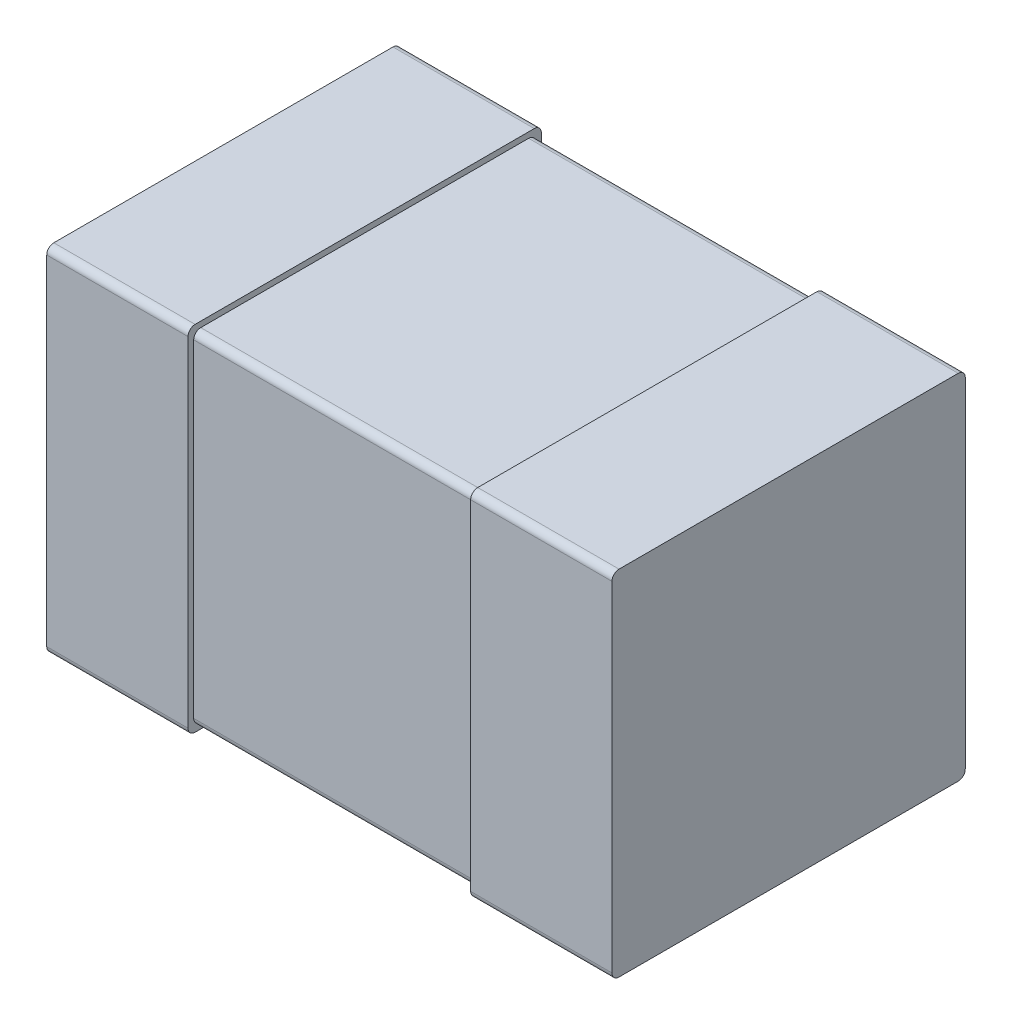
ISO-10303-21;
HEADER;
FILE_DESCRIPTION(('STEP AP214'),'2;1');
FILE_NAME('part.step','',(''),(''),'','','');
FILE_SCHEMA(('AUTOMOTIVE_DESIGN { 1 0 10303 214 1 1 1 1 }'));
ENDSEC;
DATA;
#1=APPLICATION_CONTEXT('core data for automotive mechanical design processes');
#2=APPLICATION_PROTOCOL_DEFINITION('international standard','automotive_design',2000,#1);
#3=PRODUCT_CONTEXT('',#1,'mechanical');
#4=PRODUCT('Part','Part','',(#3));
#5=PRODUCT_RELATED_PRODUCT_CATEGORY('part','',(#4));
#6=PRODUCT_DEFINITION_FORMATION('','',#4);
#7=PRODUCT_DEFINITION_CONTEXT('part definition',#1,'design');
#8=PRODUCT_DEFINITION('design','',#6,#7);
#9=PRODUCT_DEFINITION_SHAPE('','',#8);
#10=(LENGTH_UNIT() NAMED_UNIT(*) SI_UNIT(.MILLI.,.METRE.));
#11=(NAMED_UNIT(*) PLANE_ANGLE_UNIT() SI_UNIT($,.RADIAN.));
#12=(NAMED_UNIT(*) SI_UNIT($,.STERADIAN.) SOLID_ANGLE_UNIT());
#13=UNCERTAINTY_MEASURE_WITH_UNIT(LENGTH_MEASURE(1.E-05),#10,'distance_accuracy_value','');
#14=(GEOMETRIC_REPRESENTATION_CONTEXT(3) GLOBAL_UNCERTAINTY_ASSIGNED_CONTEXT((#13)) GLOBAL_UNIT_ASSIGNED_CONTEXT((#10,
#11,#12)) REPRESENTATION_CONTEXT('',''));
#15=CARTESIAN_POINT('',(0.,0.,0.));
#16=DIRECTION('',(0.,0.,1.));
#17=DIRECTION('',(1.,0.,0.));
#18=AXIS2_PLACEMENT_3D('',#15,#16,#17);
#19=CARTESIAN_POINT('',(-1.,-0.625,0.));
#20=DIRECTION('',(1.,0.,0.));
#21=DIRECTION('',(0.,0.,-1.));
#22=AXIS2_PLACEMENT_3D('',#19,#20,#21);
#23=PLANE('',#22);
#24=DIRECTION('',(0.,1.,0.));
#25=VECTOR('',#24,1.);
#26=CARTESIAN_POINT('',(-1.,-0.625,1.25));
#27=LINE('',#26,#25);
#28=CARTESIAN_POINT('',(-1.,0.6,1.25));
#29=VERTEX_POINT('',#28);
#30=CARTESIAN_POINT('',(-1.,-0.6,1.25));
#31=VERTEX_POINT('',#30);
#32=EDGE_CURVE('E210',#29,#31,#27,.F.);
#33=ORIENTED_EDGE('',*,*,#32,.F.);
#34=CARTESIAN_POINT('',(-1.,0.6,1.225));
#35=DIRECTION('',(1.,0.,0.));
#36=DIRECTION('',(0.,0.,-1.));
#37=AXIS2_PLACEMENT_3D('',#34,#35,#36);
#38=CIRCLE('',#37,0.025);
#39=CARTESIAN_POINT('',(-1.,0.625,1.225));
#40=VERTEX_POINT('',#39);
#41=EDGE_CURVE('E220',#40,#29,#38,.T.);
#42=ORIENTED_EDGE('',*,*,#41,.F.);
#43=DIRECTION('',(0.,0.,1.));
#44=VECTOR('',#43,1.);
#45=CARTESIAN_POINT('',(-1.,0.625,0.));
#46=LINE('',#45,#44);
#47=CARTESIAN_POINT('',(-1.,0.625,0.025));
#48=VERTEX_POINT('',#47);
#49=EDGE_CURVE('E217',#48,#40,#46,.T.);
#50=ORIENTED_EDGE('',*,*,#49,.F.);
#51=CARTESIAN_POINT('',(-1.,0.6,0.025));
#52=DIRECTION('',(1.,0.,0.));
#53=DIRECTION('',(0.,0.,-1.));
#54=AXIS2_PLACEMENT_3D('',#51,#52,#53);
#55=CIRCLE('',#54,0.025);
#56=CARTESIAN_POINT('',(-1.,0.6,0.));
#57=VERTEX_POINT('',#56);
#58=EDGE_CURVE('E179',#57,#48,#55,.T.);
#59=ORIENTED_EDGE('',*,*,#58,.F.);
#60=DIRECTION('',(0.,1.,0.));
#61=VECTOR('',#60,1.);
#62=CARTESIAN_POINT('',(-1.,-0.625,0.));
#63=LINE('',#62,#61);
#64=CARTESIAN_POINT('',(-1.,-0.6,0.));
#65=VERTEX_POINT('',#64);
#66=EDGE_CURVE('E177',#57,#65,#63,.F.);
#67=ORIENTED_EDGE('',*,*,#66,.T.);
#68=CARTESIAN_POINT('',(-1.,-0.6,0.025));
#69=DIRECTION('',(1.,0.,0.));
#70=DIRECTION('',(0.,0.,-1.));
#71=AXIS2_PLACEMENT_3D('',#68,#69,#70);
#72=CIRCLE('',#71,0.025);
#73=CARTESIAN_POINT('',(-1.,-0.625,0.025));
#74=VERTEX_POINT('',#73);
#75=EDGE_CURVE('E19',#74,#65,#72,.T.);
#76=ORIENTED_EDGE('',*,*,#75,.F.);
#77=DIRECTION('',(0.,0.,1.));
#78=VECTOR('',#77,1.);
#79=CARTESIAN_POINT('',(-1.,-0.625,0.));
#80=LINE('',#79,#78);
#81=CARTESIAN_POINT('',(-1.,-0.625,1.225));
#82=VERTEX_POINT('',#81);
#83=EDGE_CURVE('E193',#74,#82,#80,.T.);
#84=ORIENTED_EDGE('',*,*,#83,.T.);
#85=CARTESIAN_POINT('',(-1.,-0.6,1.225));
#86=DIRECTION('',(1.,0.,0.));
#87=DIRECTION('',(0.,0.,-1.));
#88=AXIS2_PLACEMENT_3D('',#85,#86,#87);
#89=CIRCLE('',#88,0.025);
#90=EDGE_CURVE('E316',#31,#82,#89,.T.);
#91=ORIENTED_EDGE('',*,*,#90,.F.);
#92=EDGE_LOOP('',(#33,#42,#50,#59,#67,#76,#84,#91));
#93=FACE_BOUND('',#92,.T.);
#94=ADVANCED_FACE('F16',(#93),#23,.F.);
#95=CARTESIAN_POINT('',(-1.,-0.625,0.));
#96=DIRECTION('',(0.,1.,0.));
#97=DIRECTION('',(0.,0.,1.));
#98=AXIS2_PLACEMENT_3D('',#95,#96,#97);
#99=PLANE('',#98);
#100=ORIENTED_EDGE('',*,*,#83,.F.);
#101=DIRECTION('',(1.,0.,0.));
#102=VECTOR('',#101,1.);
#103=CARTESIAN_POINT('',(-1.,-0.625,0.025));
#104=LINE('',#103,#102);
#105=CARTESIAN_POINT('',(-0.5,-0.625,0.025));
#106=VERTEX_POINT('',#105);
#107=EDGE_CURVE('E185',#106,#74,#104,.F.);
#108=ORIENTED_EDGE('',*,*,#107,.F.);
#109=DIRECTION('',(0.,0.,-1.));
#110=VECTOR('',#109,1.);
#111=CARTESIAN_POINT('',(-0.5,-0.625,0.));
#112=LINE('',#111,#110);
#113=CARTESIAN_POINT('',(-0.5,-0.625,1.225));
#114=VERTEX_POINT('',#113);
#115=EDGE_CURVE('E315',#114,#106,#112,.T.);
#116=ORIENTED_EDGE('',*,*,#115,.F.);
#117=DIRECTION('',(1.,0.,0.));
#118=VECTOR('',#117,1.);
#119=CARTESIAN_POINT('',(-1.,-0.625,1.225));
#120=LINE('',#119,#118);
#121=EDGE_CURVE('E338',#82,#114,#120,.T.);
#122=ORIENTED_EDGE('',*,*,#121,.F.);
#123=EDGE_LOOP('',(#100,#108,#116,#122));
#124=FACE_BOUND('',#123,.T.);
#125=ADVANCED_FACE('F557',(#124),#99,.F.);
#126=CARTESIAN_POINT('',(-1.,-0.6,0.025));
#127=DIRECTION('',(1.,0.,0.));
#128=DIRECTION('',(0.,0.,-1.));
#129=AXIS2_PLACEMENT_3D('',#126,#127,#128);
#130=CYLINDRICAL_SURFACE('',#129,0.025);
#131=CARTESIAN_POINT('',(-0.5,-0.6,0.025));
#132=DIRECTION('',(1.,0.,0.));
#133=DIRECTION('',(0.,0.,-1.));
#134=AXIS2_PLACEMENT_3D('',#131,#132,#133);
#135=CIRCLE('',#134,0.025);
#136=CARTESIAN_POINT('',(-0.5,-0.6,0.));
#137=VERTEX_POINT('',#136);
#138=EDGE_CURVE('E312',#106,#137,#135,.T.);
#139=ORIENTED_EDGE('',*,*,#138,.F.);
#140=ORIENTED_EDGE('',*,*,#107,.T.);
#141=ORIENTED_EDGE('',*,*,#75,.T.);
#142=DIRECTION('',(1.,0.,0.));
#143=VECTOR('',#142,1.);
#144=CARTESIAN_POINT('',(-1.,-0.6,0.));
#145=LINE('',#144,#143);
#146=EDGE_CURVE('E184',#65,#137,#145,.T.);
#147=ORIENTED_EDGE('',*,*,#146,.T.);
#148=EDGE_LOOP('',(#139,#140,#141,#147));
#149=FACE_BOUND('',#148,.T.);
#150=ADVANCED_FACE('F190',(#149),#130,.T.);
#151=CARTESIAN_POINT('',(-1.,-0.625,0.));
#152=DIRECTION('',(0.,0.,1.));
#153=DIRECTION('',(1.,0.,0.));
#154=AXIS2_PLACEMENT_3D('',#151,#152,#153);
#155=PLANE('',#154);
#156=DIRECTION('',(0.,1.,0.));
#157=VECTOR('',#156,1.);
#158=CARTESIAN_POINT('',(-0.5,-0.625,0.));
#159=LINE('',#158,#157);
#160=CARTESIAN_POINT('',(-0.5,0.6,0.));
#161=VERTEX_POINT('',#160);
#162=EDGE_CURVE('E196',#137,#161,#159,.T.);
#163=ORIENTED_EDGE('',*,*,#162,.F.);
#164=ORIENTED_EDGE('',*,*,#146,.F.);
#165=ORIENTED_EDGE('',*,*,#66,.F.);
#166=DIRECTION('',(1.,0.,0.));
#167=VECTOR('',#166,1.);
#168=CARTESIAN_POINT('',(-1.,0.6,0.));
#169=LINE('',#168,#167);
#170=EDGE_CURVE('E199',#161,#57,#169,.F.);
#171=ORIENTED_EDGE('',*,*,#170,.F.);
#172=EDGE_LOOP('',(#163,#164,#165,#171));
#173=FACE_BOUND('',#172,.T.);
#174=ADVANCED_FACE('F194',(#173),#155,.F.);
#175=CARTESIAN_POINT('',(-1.,0.6,0.025));
#176=DIRECTION('',(1.,0.,0.));
#177=DIRECTION('',(0.,0.,-1.));
#178=AXIS2_PLACEMENT_3D('',#175,#176,#177);
#179=CYLINDRICAL_SURFACE('',#178,0.025);
#180=ORIENTED_EDGE('',*,*,#170,.T.);
#181=ORIENTED_EDGE('',*,*,#58,.T.);
#182=DIRECTION('',(1.,0.,0.));
#183=VECTOR('',#182,1.);
#184=CARTESIAN_POINT('',(-1.,0.625,0.025));
#185=LINE('',#184,#183);
#186=CARTESIAN_POINT('',(-0.5,0.625,0.025));
#187=VERTEX_POINT('',#186);
#188=EDGE_CURVE('E221',#187,#48,#185,.F.);
#189=ORIENTED_EDGE('',*,*,#188,.F.);
#190=CARTESIAN_POINT('',(-0.5,0.6,0.025));
#191=DIRECTION('',(1.,0.,0.));
#192=DIRECTION('',(0.,0.,-1.));
#193=AXIS2_PLACEMENT_3D('',#190,#191,#192);
#194=CIRCLE('',#193,0.025);
#195=EDGE_CURVE('E308',#161,#187,#194,.T.);
#196=ORIENTED_EDGE('',*,*,#195,.F.);
#197=EDGE_LOOP('',(#180,#181,#189,#196));
#198=FACE_BOUND('',#197,.T.);
#199=ADVANCED_FACE('F551',(#198),#179,.T.);
#200=CARTESIAN_POINT('',(-1.,0.625,0.));
#201=DIRECTION('',(0.,1.,0.));
#202=DIRECTION('',(0.,0.,1.));
#203=AXIS2_PLACEMENT_3D('',#200,#201,#202);
#204=PLANE('',#203);
#205=ORIENTED_EDGE('',*,*,#49,.T.);
#206=DIRECTION('',(1.,0.,0.));
#207=VECTOR('',#206,1.);
#208=CARTESIAN_POINT('',(-1.,0.625,1.225));
#209=LINE('',#208,#207);
#210=CARTESIAN_POINT('',(-0.5,0.625,1.225));
#211=VERTEX_POINT('',#210);
#212=EDGE_CURVE('E214',#211,#40,#209,.F.);
#213=ORIENTED_EDGE('',*,*,#212,.F.);
#214=DIRECTION('',(0.,0.,-1.));
#215=VECTOR('',#214,1.);
#216=CARTESIAN_POINT('',(-0.5,0.625,0.));
#217=LINE('',#216,#215);
#218=EDGE_CURVE('E307',#187,#211,#217,.F.);
#219=ORIENTED_EDGE('',*,*,#218,.F.);
#220=ORIENTED_EDGE('',*,*,#188,.T.);
#221=EDGE_LOOP('',(#205,#213,#219,#220));
#222=FACE_BOUND('',#221,.T.);
#223=ADVANCED_FACE('F547',(#222),#204,.T.);
#224=CARTESIAN_POINT('',(-1.,0.6,1.225));
#225=DIRECTION('',(1.,0.,0.));
#226=DIRECTION('',(0.,0.,-1.));
#227=AXIS2_PLACEMENT_3D('',#224,#225,#226);
#228=CYLINDRICAL_SURFACE('',#227,0.025);
#229=CARTESIAN_POINT('',(-0.5,0.6,1.225));
#230=DIRECTION('',(1.,0.,0.));
#231=DIRECTION('',(0.,0.,-1.));
#232=AXIS2_PLACEMENT_3D('',#229,#230,#231);
#233=CIRCLE('',#232,0.025);
#234=CARTESIAN_POINT('',(-0.5,0.6,1.25));
#235=VERTEX_POINT('',#234);
#236=EDGE_CURVE('E303',#211,#235,#233,.T.);
#237=ORIENTED_EDGE('',*,*,#236,.F.);
#238=ORIENTED_EDGE('',*,*,#212,.T.);
#239=ORIENTED_EDGE('',*,*,#41,.T.);
#240=DIRECTION('',(1.,0.,0.));
#241=VECTOR('',#240,1.);
#242=CARTESIAN_POINT('',(-1.,0.6,1.25));
#243=LINE('',#242,#241);
#244=EDGE_CURVE('E213',#235,#29,#243,.F.);
#245=ORIENTED_EDGE('',*,*,#244,.F.);
#246=EDGE_LOOP('',(#237,#238,#239,#245));
#247=FACE_BOUND('',#246,.T.);
#248=ADVANCED_FACE('F543',(#247),#228,.T.);
#249=CARTESIAN_POINT('',(-1.,-0.625,1.25));
#250=DIRECTION('',(0.,0.,1.));
#251=DIRECTION('',(1.,0.,0.));
#252=AXIS2_PLACEMENT_3D('',#249,#250,#251);
#253=PLANE('',#252);
#254=DIRECTION('',(0.,1.,0.));
#255=VECTOR('',#254,1.);
#256=CARTESIAN_POINT('',(-0.5,-0.625,1.25));
#257=LINE('',#256,#255);
#258=CARTESIAN_POINT('',(-0.5,-0.6,1.25));
#259=VERTEX_POINT('',#258);
#260=EDGE_CURVE('E302',#235,#259,#257,.F.);
#261=ORIENTED_EDGE('',*,*,#260,.F.);
#262=ORIENTED_EDGE('',*,*,#244,.T.);
#263=ORIENTED_EDGE('',*,*,#32,.T.);
#264=DIRECTION('',(1.,0.,0.));
#265=VECTOR('',#264,1.);
#266=CARTESIAN_POINT('',(-1.,-0.6,1.25));
#267=LINE('',#266,#265);
#268=EDGE_CURVE('E320',#259,#31,#267,.F.);
#269=ORIENTED_EDGE('',*,*,#268,.F.);
#270=EDGE_LOOP('',(#261,#262,#263,#269));
#271=FACE_BOUND('',#270,.T.);
#272=ADVANCED_FACE('F539',(#271),#253,.T.);
#273=CARTESIAN_POINT('',(-1.,-0.6,1.225));
#274=DIRECTION('',(1.,0.,0.));
#275=DIRECTION('',(0.,0.,-1.));
#276=AXIS2_PLACEMENT_3D('',#273,#274,#275);
#277=CYLINDRICAL_SURFACE('',#276,0.025);
#278=ORIENTED_EDGE('',*,*,#268,.T.);
#279=ORIENTED_EDGE('',*,*,#90,.T.);
#280=ORIENTED_EDGE('',*,*,#121,.T.);
#281=CARTESIAN_POINT('',(-0.5,-0.6,1.225));
#282=DIRECTION('',(1.,0.,0.));
#283=DIRECTION('',(0.,0.,-1.));
#284=AXIS2_PLACEMENT_3D('',#281,#282,#283);
#285=CIRCLE('',#284,0.025);
#286=EDGE_CURVE('E299',#259,#114,#285,.T.);
#287=ORIENTED_EDGE('',*,*,#286,.F.);
#288=EDGE_LOOP('',(#278,#279,#280,#287));
#289=FACE_BOUND('',#288,.T.);
#290=ADVANCED_FACE('F535',(#289),#277,.T.);
#291=CARTESIAN_POINT('',(-0.5,-0.625,0.));
#292=DIRECTION('',(1.,0.,0.));
#293=DIRECTION('',(0.,0.,-1.));
#294=AXIS2_PLACEMENT_3D('',#291,#292,#293);
#295=PLANE('',#294);
#296=CARTESIAN_POINT('',(-0.5,0.58,0.045));
#297=DIRECTION('',(1.,0.,0.));
#298=DIRECTION('',(0.,0.,-1.));
#299=AXIS2_PLACEMENT_3D('',#296,#297,#298);
#300=CIRCLE('',#299,0.025);
#301=CARTESIAN_POINT('',(-0.5,0.58,0.02));
#302=VERTEX_POINT('',#301);
#303=CARTESIAN_POINT('',(-0.5,0.605,0.045));
#304=VERTEX_POINT('',#303);
#305=EDGE_CURVE('E276',#302,#304,#300,.T.);
#306=ORIENTED_EDGE('',*,*,#305,.F.);
#307=DIRECTION('',(0.,1.,0.));
#308=VECTOR('',#307,1.);
#309=CARTESIAN_POINT('',(-0.5,-0.605,0.02));
#310=LINE('',#309,#308);
#311=CARTESIAN_POINT('',(-0.5,-0.58,0.02));
#312=VERTEX_POINT('',#311);
#313=EDGE_CURVE('E280',#302,#312,#310,.F.);
#314=ORIENTED_EDGE('',*,*,#313,.T.);
#315=CARTESIAN_POINT('',(-0.5,-0.58,0.045));
#316=DIRECTION('',(1.,0.,0.));
#317=DIRECTION('',(0.,0.,-1.));
#318=AXIS2_PLACEMENT_3D('',#315,#316,#317);
#319=CIRCLE('',#318,0.025);
#320=CARTESIAN_POINT('',(-0.5,-0.605,0.045));
#321=VERTEX_POINT('',#320);
#322=EDGE_CURVE('E294',#321,#312,#319,.T.);
#323=ORIENTED_EDGE('',*,*,#322,.F.);
#324=DIRECTION('',(0.,0.,1.));
#325=VECTOR('',#324,1.);
#326=CARTESIAN_POINT('',(-0.5,-0.605,0.02));
#327=LINE('',#326,#325);
#328=CARTESIAN_POINT('',(-0.5,-0.605,1.205));
#329=VERTEX_POINT('',#328);
#330=EDGE_CURVE('E345',#321,#329,#327,.T.);
#331=ORIENTED_EDGE('',*,*,#330,.T.);
#332=CARTESIAN_POINT('',(-0.5,-0.58,1.205));
#333=DIRECTION('',(1.,0.,0.));
#334=DIRECTION('',(0.,0.,-1.));
#335=AXIS2_PLACEMENT_3D('',#332,#333,#334);
#336=CIRCLE('',#335,0.025);
#337=CARTESIAN_POINT('',(-0.5,-0.58,1.23));
#338=VERTEX_POINT('',#337);
#339=EDGE_CURVE('E288',#338,#329,#336,.T.);
#340=ORIENTED_EDGE('',*,*,#339,.F.);
#341=DIRECTION('',(0.,1.,0.));
#342=VECTOR('',#341,1.);
#343=CARTESIAN_POINT('',(-0.5,-0.605,1.23));
#344=LINE('',#343,#342);
#345=CARTESIAN_POINT('',(-0.5,0.58,1.23));
#346=VERTEX_POINT('',#345);
#347=EDGE_CURVE('E292',#346,#338,#344,.F.);
#348=ORIENTED_EDGE('',*,*,#347,.F.);
#349=CARTESIAN_POINT('',(-0.5,0.58,1.205));
#350=DIRECTION('',(1.,0.,0.));
#351=DIRECTION('',(0.,0.,-1.));
#352=AXIS2_PLACEMENT_3D('',#349,#350,#351);
#353=CIRCLE('',#352,0.025);
#354=CARTESIAN_POINT('',(-0.5,0.605,1.205));
#355=VERTEX_POINT('',#354);
#356=EDGE_CURVE('E282',#355,#346,#353,.T.);
#357=ORIENTED_EDGE('',*,*,#356,.F.);
#358=DIRECTION('',(0.,0.,1.));
#359=VECTOR('',#358,1.);
#360=CARTESIAN_POINT('',(-0.5,0.605,0.02));
#361=LINE('',#360,#359);
#362=EDGE_CURVE('E351',#304,#355,#361,.T.);
#363=ORIENTED_EDGE('',*,*,#362,.F.);
#364=EDGE_LOOP('',(#306,#314,#323,#331,#340,#348,#357,#363));
#365=FACE_BOUND('',#364,.T.);
#366=ORIENTED_EDGE('',*,*,#260,.T.);
#367=ORIENTED_EDGE('',*,*,#286,.T.);
#368=ORIENTED_EDGE('',*,*,#115,.T.);
#369=ORIENTED_EDGE('',*,*,#138,.T.);
#370=ORIENTED_EDGE('',*,*,#162,.T.);
#371=ORIENTED_EDGE('',*,*,#195,.T.);
#372=ORIENTED_EDGE('',*,*,#218,.T.);
#373=ORIENTED_EDGE('',*,*,#236,.T.);
#374=EDGE_LOOP('',(#366,#367,#368,#369,#370,#371,#372,#373));
#375=FACE_BOUND('',#374,.T.);
#376=ADVANCED_FACE('F531',(#365,#375),#295,.T.);
#377=CARTESIAN_POINT('',(-0.5,-0.58,0.045));
#378=DIRECTION('',(1.,0.,0.));
#379=DIRECTION('',(0.,0.,-1.));
#380=AXIS2_PLACEMENT_3D('',#377,#378,#379);
#381=CYLINDRICAL_SURFACE('',#380,0.025);
#382=CARTESIAN_POINT('',(0.5,-0.58,0.045));
#383=DIRECTION('',(1.,0.,0.));
#384=DIRECTION('',(0.,0.,-1.));
#385=AXIS2_PLACEMENT_3D('',#382,#383,#384);
#386=CIRCLE('',#385,0.025);
#387=CARTESIAN_POINT('',(0.5,-0.58,0.02));
#388=VERTEX_POINT('',#387);
#389=CARTESIAN_POINT('',(0.5,-0.605,0.045));
#390=VERTEX_POINT('',#389);
#391=EDGE_CURVE('E272',#388,#390,#386,.F.);
#392=ORIENTED_EDGE('',*,*,#391,.T.);
#393=DIRECTION('',(1.,0.,0.));
#394=VECTOR('',#393,1.);
#395=CARTESIAN_POINT('',(-0.5,-0.605,0.045));
#396=LINE('',#395,#394);
#397=EDGE_CURVE('E298',#390,#321,#396,.F.);
#398=ORIENTED_EDGE('',*,*,#397,.T.);
#399=ORIENTED_EDGE('',*,*,#322,.T.);
#400=DIRECTION('',(1.,0.,0.));
#401=VECTOR('',#400,1.);
#402=CARTESIAN_POINT('',(-0.5,-0.58,0.02));
#403=LINE('',#402,#401);
#404=EDGE_CURVE('E368',#312,#388,#403,.T.);
#405=ORIENTED_EDGE('',*,*,#404,.T.);
#406=EDGE_LOOP('',(#392,#398,#399,#405));
#407=FACE_BOUND('',#406,.T.);
#408=ADVANCED_FACE('F527',(#407),#381,.T.);
#409=CARTESIAN_POINT('',(-0.5,-0.605,0.02));
#410=DIRECTION('',(0.,1.,0.));
#411=DIRECTION('',(0.,0.,1.));
#412=AXIS2_PLACEMENT_3D('',#409,#410,#411);
#413=PLANE('',#412);
#414=ORIENTED_EDGE('',*,*,#330,.F.);
#415=ORIENTED_EDGE('',*,*,#397,.F.);
#416=DIRECTION('',(0.,0.,-1.));
#417=VECTOR('',#416,1.);
#418=CARTESIAN_POINT('',(0.5,-0.605,0.));
#419=LINE('',#418,#417);
#420=CARTESIAN_POINT('',(0.5,-0.605,1.205));
#421=VERTEX_POINT('',#420);
#422=EDGE_CURVE('E271',#390,#421,#419,.F.);
#423=ORIENTED_EDGE('',*,*,#422,.T.);
#424=DIRECTION('',(1.,0.,0.));
#425=VECTOR('',#424,1.);
#426=CARTESIAN_POINT('',(-0.5,-0.605,1.205));
#427=LINE('',#426,#425);
#428=EDGE_CURVE('E293',#329,#421,#427,.T.);
#429=ORIENTED_EDGE('',*,*,#428,.F.);
#430=EDGE_LOOP('',(#414,#415,#423,#429));
#431=FACE_BOUND('',#430,.T.);
#432=ADVANCED_FACE('F523',(#431),#413,.F.);
#433=CARTESIAN_POINT('',(-0.5,-0.58,1.205));
#434=DIRECTION('',(1.,0.,0.));
#435=DIRECTION('',(0.,0.,-1.));
#436=AXIS2_PLACEMENT_3D('',#433,#434,#435);
#437=CYLINDRICAL_SURFACE('',#436,0.025);
#438=DIRECTION('',(1.,0.,0.));
#439=VECTOR('',#438,1.);
#440=CARTESIAN_POINT('',(-0.5,-0.58,1.23));
#441=LINE('',#440,#439);
#442=CARTESIAN_POINT('',(0.5,-0.58,1.23));
#443=VERTEX_POINT('',#442);
#444=EDGE_CURVE('E287',#338,#443,#441,.T.);
#445=ORIENTED_EDGE('',*,*,#444,.F.);
#446=ORIENTED_EDGE('',*,*,#339,.T.);
#447=ORIENTED_EDGE('',*,*,#428,.T.);
#448=CARTESIAN_POINT('',(0.5,-0.58,1.205));
#449=DIRECTION('',(1.,0.,0.));
#450=DIRECTION('',(0.,0.,-1.));
#451=AXIS2_PLACEMENT_3D('',#448,#449,#450);
#452=CIRCLE('',#451,0.025);
#453=EDGE_CURVE('E268',#421,#443,#452,.F.);
#454=ORIENTED_EDGE('',*,*,#453,.T.);
#455=EDGE_LOOP('',(#445,#446,#447,#454));
#456=FACE_BOUND('',#455,.T.);
#457=ADVANCED_FACE('F519',(#456),#437,.T.);
#458=CARTESIAN_POINT('',(-0.5,-0.605,1.23));
#459=DIRECTION('',(0.,0.,1.));
#460=DIRECTION('',(1.,0.,0.));
#461=AXIS2_PLACEMENT_3D('',#458,#459,#460);
#462=PLANE('',#461);
#463=DIRECTION('',(0.,1.,0.));
#464=VECTOR('',#463,1.);
#465=CARTESIAN_POINT('',(0.5,-0.625,1.23));
#466=LINE('',#465,#464);
#467=CARTESIAN_POINT('',(0.5,0.58,1.23));
#468=VERTEX_POINT('',#467);
#469=EDGE_CURVE('E267',#443,#468,#466,.T.);
#470=ORIENTED_EDGE('',*,*,#469,.T.);
#471=DIRECTION('',(1.,0.,0.));
#472=VECTOR('',#471,1.);
#473=CARTESIAN_POINT('',(-0.5,0.58,1.23));
#474=LINE('',#473,#472);
#475=EDGE_CURVE('E286',#346,#468,#474,.T.);
#476=ORIENTED_EDGE('',*,*,#475,.F.);
#477=ORIENTED_EDGE('',*,*,#347,.T.);
#478=ORIENTED_EDGE('',*,*,#444,.T.);
#479=EDGE_LOOP('',(#470,#476,#477,#478));
#480=FACE_BOUND('',#479,.T.);
#481=ADVANCED_FACE('F515',(#480),#462,.T.);
#482=CARTESIAN_POINT('',(-0.5,0.58,1.205));
#483=DIRECTION('',(1.,0.,0.));
#484=DIRECTION('',(0.,0.,-1.));
#485=AXIS2_PLACEMENT_3D('',#482,#483,#484);
#486=CYLINDRICAL_SURFACE('',#485,0.025);
#487=CARTESIAN_POINT('',(0.5,0.58,1.205));
#488=DIRECTION('',(1.,0.,0.));
#489=DIRECTION('',(0.,0.,-1.));
#490=AXIS2_PLACEMENT_3D('',#487,#488,#489);
#491=CIRCLE('',#490,0.025);
#492=CARTESIAN_POINT('',(0.5,0.605,1.205));
#493=VERTEX_POINT('',#492);
#494=EDGE_CURVE('E264',#468,#493,#491,.F.);
#495=ORIENTED_EDGE('',*,*,#494,.T.);
#496=DIRECTION('',(1.,0.,0.));
#497=VECTOR('',#496,1.);
#498=CARTESIAN_POINT('',(-0.5,0.605,1.205));
#499=LINE('',#498,#497);
#500=EDGE_CURVE('E355',#355,#493,#499,.T.);
#501=ORIENTED_EDGE('',*,*,#500,.F.);
#502=ORIENTED_EDGE('',*,*,#356,.T.);
#503=ORIENTED_EDGE('',*,*,#475,.T.);
#504=EDGE_LOOP('',(#495,#501,#502,#503));
#505=FACE_BOUND('',#504,.T.);
#506=ADVANCED_FACE('F511',(#505),#486,.T.);
#507=CARTESIAN_POINT('',(-0.5,0.605,0.02));
#508=DIRECTION('',(0.,1.,0.));
#509=DIRECTION('',(0.,0.,1.));
#510=AXIS2_PLACEMENT_3D('',#507,#508,#509);
#511=PLANE('',#510);
#512=ORIENTED_EDGE('',*,*,#362,.T.);
#513=ORIENTED_EDGE('',*,*,#500,.T.);
#514=DIRECTION('',(0.,0.,-1.));
#515=VECTOR('',#514,1.);
#516=CARTESIAN_POINT('',(0.5,0.605,0.));
#517=LINE('',#516,#515);
#518=CARTESIAN_POINT('',(0.5,0.605,0.045));
#519=VERTEX_POINT('',#518);
#520=EDGE_CURVE('E263',#493,#519,#517,.T.);
#521=ORIENTED_EDGE('',*,*,#520,.T.);
#522=DIRECTION('',(1.,0.,0.));
#523=VECTOR('',#522,1.);
#524=CARTESIAN_POINT('',(-0.5,0.605,0.045));
#525=LINE('',#524,#523);
#526=EDGE_CURVE('E281',#304,#519,#525,.T.);
#527=ORIENTED_EDGE('',*,*,#526,.F.);
#528=EDGE_LOOP('',(#512,#513,#521,#527));
#529=FACE_BOUND('',#528,.T.);
#530=ADVANCED_FACE('F507',(#529),#511,.T.);
#531=CARTESIAN_POINT('',(-0.5,0.58,0.045));
#532=DIRECTION('',(1.,0.,0.));
#533=DIRECTION('',(0.,0.,-1.));
#534=AXIS2_PLACEMENT_3D('',#531,#532,#533);
#535=CYLINDRICAL_SURFACE('',#534,0.025);
#536=DIRECTION('',(1.,0.,0.));
#537=VECTOR('',#536,1.);
#538=CARTESIAN_POINT('',(-0.5,0.58,0.02));
#539=LINE('',#538,#537);
#540=CARTESIAN_POINT('',(0.5,0.58,0.02));
#541=VERTEX_POINT('',#540);
#542=EDGE_CURVE('E275',#541,#302,#539,.F.);
#543=ORIENTED_EDGE('',*,*,#542,.T.);
#544=ORIENTED_EDGE('',*,*,#305,.T.);
#545=ORIENTED_EDGE('',*,*,#526,.T.);
#546=CARTESIAN_POINT('',(0.5,0.58,0.045));
#547=DIRECTION('',(1.,0.,0.));
#548=DIRECTION('',(0.,0.,-1.));
#549=AXIS2_PLACEMENT_3D('',#546,#547,#548);
#550=CIRCLE('',#549,0.025);
#551=EDGE_CURVE('E259',#519,#541,#550,.F.);
#552=ORIENTED_EDGE('',*,*,#551,.T.);
#553=EDGE_LOOP('',(#543,#544,#545,#552));
#554=FACE_BOUND('',#553,.T.);
#555=ADVANCED_FACE('F503',(#554),#535,.T.);
#556=CARTESIAN_POINT('',(-0.5,-0.605,0.02));
#557=DIRECTION('',(0.,0.,1.));
#558=DIRECTION('',(1.,0.,0.));
#559=AXIS2_PLACEMENT_3D('',#556,#557,#558);
#560=PLANE('',#559);
#561=DIRECTION('',(0.,1.,0.));
#562=VECTOR('',#561,1.);
#563=CARTESIAN_POINT('',(0.5,-0.625,0.02));
#564=LINE('',#563,#562);
#565=EDGE_CURVE('E262',#541,#388,#564,.F.);
#566=ORIENTED_EDGE('',*,*,#565,.T.);
#567=ORIENTED_EDGE('',*,*,#404,.F.);
#568=ORIENTED_EDGE('',*,*,#313,.F.);
#569=ORIENTED_EDGE('',*,*,#542,.F.);
#570=EDGE_LOOP('',(#566,#567,#568,#569));
#571=FACE_BOUND('',#570,.T.);
#572=ADVANCED_FACE('F499',(#571),#560,.F.);
#573=CARTESIAN_POINT('',(0.5,-0.625,0.));
#574=DIRECTION('',(1.,0.,0.));
#575=DIRECTION('',(0.,0.,-1.));
#576=AXIS2_PLACEMENT_3D('',#573,#574,#575);
#577=PLANE('',#576);
#578=ORIENTED_EDGE('',*,*,#551,.F.);
#579=ORIENTED_EDGE('',*,*,#520,.F.);
#580=ORIENTED_EDGE('',*,*,#494,.F.);
#581=ORIENTED_EDGE('',*,*,#469,.F.);
#582=ORIENTED_EDGE('',*,*,#453,.F.);
#583=ORIENTED_EDGE('',*,*,#422,.F.);
#584=ORIENTED_EDGE('',*,*,#391,.F.);
#585=ORIENTED_EDGE('',*,*,#565,.F.);
#586=EDGE_LOOP('',(#578,#579,#580,#581,#582,#583,#584,#585));
#587=FACE_BOUND('',#586,.T.);
#588=DIRECTION('',(0.,1.,0.));
#589=VECTOR('',#588,1.);
#590=CARTESIAN_POINT('',(0.5,-0.625,1.25));
#591=LINE('',#590,#589);
#592=CARTESIAN_POINT('',(0.5,0.6,1.25));
#593=VERTEX_POINT('',#592);
#594=CARTESIAN_POINT('',(0.5,-0.6,1.25));
#595=VERTEX_POINT('',#594);
#596=EDGE_CURVE('E401',#593,#595,#591,.F.);
#597=ORIENTED_EDGE('',*,*,#596,.F.);
#598=CARTESIAN_POINT('',(0.5,0.6,1.225));
#599=DIRECTION('',(1.,0.,0.));
#600=DIRECTION('',(0.,0.,-1.));
#601=AXIS2_PLACEMENT_3D('',#598,#599,#600);
#602=CIRCLE('',#601,0.025);
#603=CARTESIAN_POINT('',(0.5,0.625,1.225));
#604=VERTEX_POINT('',#603);
#605=EDGE_CURVE('E242',#604,#593,#602,.T.);
#606=ORIENTED_EDGE('',*,*,#605,.F.);
#607=DIRECTION('',(0.,0.,1.));
#608=VECTOR('',#607,1.);
#609=CARTESIAN_POINT('',(0.5,0.625,0.));
#610=LINE('',#609,#608);
#611=CARTESIAN_POINT('',(0.5,0.625,0.025));
#612=VERTEX_POINT('',#611);
#613=EDGE_CURVE('E247',#612,#604,#610,.T.);
#614=ORIENTED_EDGE('',*,*,#613,.F.);
#615=CARTESIAN_POINT('',(0.5,0.6,0.025));
#616=DIRECTION('',(1.,0.,0.));
#617=DIRECTION('',(0.,0.,-1.));
#618=AXIS2_PLACEMENT_3D('',#615,#616,#617);
#619=CIRCLE('',#618,0.025);
#620=CARTESIAN_POINT('',(0.5,0.6,0.));
#621=VERTEX_POINT('',#620);
#622=EDGE_CURVE('E248',#621,#612,#619,.T.);
#623=ORIENTED_EDGE('',*,*,#622,.F.);
#624=DIRECTION('',(0.,1.,0.));
#625=VECTOR('',#624,1.);
#626=CARTESIAN_POINT('',(0.5,-0.625,0.));
#627=LINE('',#626,#625);
#628=CARTESIAN_POINT('',(0.5,-0.6,0.));
#629=VERTEX_POINT('',#628);
#630=EDGE_CURVE('E392',#621,#629,#627,.F.);
#631=ORIENTED_EDGE('',*,*,#630,.T.);
#632=CARTESIAN_POINT('',(0.5,-0.6,0.025));
#633=DIRECTION('',(1.,0.,0.));
#634=DIRECTION('',(0.,0.,-1.));
#635=AXIS2_PLACEMENT_3D('',#632,#633,#634);
#636=CIRCLE('',#635,0.025);
#637=CARTESIAN_POINT('',(0.5,-0.625,0.025));
#638=VERTEX_POINT('',#637);
#639=EDGE_CURVE('E253',#638,#629,#636,.T.);
#640=ORIENTED_EDGE('',*,*,#639,.F.);
#641=DIRECTION('',(0.,0.,1.));
#642=VECTOR('',#641,1.);
#643=CARTESIAN_POINT('',(0.5,-0.625,0.));
#644=LINE('',#643,#642);
#645=CARTESIAN_POINT('',(0.5,-0.625,1.225));
#646=VERTEX_POINT('',#645);
#647=EDGE_CURVE('E258',#638,#646,#644,.T.);
#648=ORIENTED_EDGE('',*,*,#647,.T.);
#649=CARTESIAN_POINT('',(0.5,-0.6,1.225));
#650=DIRECTION('',(1.,0.,0.));
#651=DIRECTION('',(0.,0.,-1.));
#652=AXIS2_PLACEMENT_3D('',#649,#650,#651);
#653=CIRCLE('',#652,0.025);
#654=EDGE_CURVE('E238',#595,#646,#653,.T.);
#655=ORIENTED_EDGE('',*,*,#654,.F.);
#656=EDGE_LOOP('',(#597,#606,#614,#623,#631,#640,#648,#655));
#657=FACE_BOUND('',#656,.T.);
#658=ADVANCED_FACE('F455',(#587,#657),#577,.F.);
#659=CARTESIAN_POINT('',(0.5,-0.625,0.));
#660=DIRECTION('',(0.,1.,0.));
#661=DIRECTION('',(0.,0.,1.));
#662=AXIS2_PLACEMENT_3D('',#659,#660,#661);
#663=PLANE('',#662);
#664=ORIENTED_EDGE('',*,*,#647,.F.);
#665=DIRECTION('',(1.,0.,0.));
#666=VECTOR('',#665,1.);
#667=CARTESIAN_POINT('',(0.5,-0.625,0.025));
#668=LINE('',#667,#666);
#669=CARTESIAN_POINT('',(1.,-0.625,0.025));
#670=VERTEX_POINT('',#669);
#671=EDGE_CURVE('E257',#670,#638,#668,.F.);
#672=ORIENTED_EDGE('',*,*,#671,.F.);
#673=DIRECTION('',(0.,0.,-1.));
#674=VECTOR('',#673,1.);
#675=CARTESIAN_POINT('',(1.,-0.625,0.));
#676=LINE('',#675,#674);
#677=CARTESIAN_POINT('',(1.,-0.625,1.225));
#678=VERTEX_POINT('',#677);
#679=EDGE_CURVE('E237',#678,#670,#676,.T.);
#680=ORIENTED_EDGE('',*,*,#679,.F.);
#681=DIRECTION('',(1.,0.,0.));
#682=VECTOR('',#681,1.);
#683=CARTESIAN_POINT('',(0.5,-0.625,1.225));
#684=LINE('',#683,#682);
#685=EDGE_CURVE('E429',#646,#678,#684,.T.);
#686=ORIENTED_EDGE('',*,*,#685,.F.);
#687=EDGE_LOOP('',(#664,#672,#680,#686));
#688=FACE_BOUND('',#687,.T.);
#689=ADVANCED_FACE('F473',(#688),#663,.F.);
#690=CARTESIAN_POINT('',(0.5,-0.6,0.025));
#691=DIRECTION('',(1.,0.,0.));
#692=DIRECTION('',(0.,0.,-1.));
#693=AXIS2_PLACEMENT_3D('',#690,#691,#692);
#694=CYLINDRICAL_SURFACE('',#693,0.025);
#695=CARTESIAN_POINT('',(1.,-0.6,0.025));
#696=DIRECTION('',(1.,0.,0.));
#697=DIRECTION('',(0.,0.,-1.));
#698=AXIS2_PLACEMENT_3D('',#695,#696,#697);
#699=CIRCLE('',#698,0.025);
#700=CARTESIAN_POINT('',(1.,-0.6,0.));
#701=VERTEX_POINT('',#700);
#702=EDGE_CURVE('E233',#670,#701,#699,.T.);
#703=ORIENTED_EDGE('',*,*,#702,.F.);
#704=ORIENTED_EDGE('',*,*,#671,.T.);
#705=ORIENTED_EDGE('',*,*,#639,.T.);
#706=DIRECTION('',(1.,0.,0.));
#707=VECTOR('',#706,1.);
#708=CARTESIAN_POINT('',(0.5,-0.6,0.));
#709=LINE('',#708,#707);
#710=EDGE_CURVE('E395',#629,#701,#709,.T.);
#711=ORIENTED_EDGE('',*,*,#710,.T.);
#712=EDGE_LOOP('',(#703,#704,#705,#711));
#713=FACE_BOUND('',#712,.T.);
#714=ADVANCED_FACE('F468',(#713),#694,.T.);
#715=CARTESIAN_POINT('',(0.5,-0.625,0.));
#716=DIRECTION('',(0.,0.,1.));
#717=DIRECTION('',(1.,0.,0.));
#718=AXIS2_PLACEMENT_3D('',#715,#716,#717);
#719=PLANE('',#718);
#720=DIRECTION('',(0.,1.,0.));
#721=VECTOR('',#720,1.);
#722=CARTESIAN_POINT('',(1.,-0.625,0.));
#723=LINE('',#722,#721);
#724=CARTESIAN_POINT('',(1.,0.6,0.));
#725=VERTEX_POINT('',#724);
#726=EDGE_CURVE('E232',#701,#725,#723,.T.);
#727=ORIENTED_EDGE('',*,*,#726,.F.);
#728=ORIENTED_EDGE('',*,*,#710,.F.);
#729=ORIENTED_EDGE('',*,*,#630,.F.);
#730=DIRECTION('',(1.,0.,0.));
#731=VECTOR('',#730,1.);
#732=CARTESIAN_POINT('',(0.5,0.6,0.));
#733=LINE('',#732,#731);
#734=EDGE_CURVE('E252',#725,#621,#733,.F.);
#735=ORIENTED_EDGE('',*,*,#734,.F.);
#736=EDGE_LOOP('',(#727,#728,#729,#735));
#737=FACE_BOUND('',#736,.T.);
#738=ADVANCED_FACE('F470',(#737),#719,.F.);
#739=CARTESIAN_POINT('',(0.5,0.6,0.025));
#740=DIRECTION('',(1.,0.,0.));
#741=DIRECTION('',(0.,0.,-1.));
#742=AXIS2_PLACEMENT_3D('',#739,#740,#741);
#743=CYLINDRICAL_SURFACE('',#742,0.025);
#744=ORIENTED_EDGE('',*,*,#734,.T.);
#745=ORIENTED_EDGE('',*,*,#622,.T.);
#746=DIRECTION('',(1.,0.,0.));
#747=VECTOR('',#746,1.);
#748=CARTESIAN_POINT('',(0.5,0.625,0.025));
#749=LINE('',#748,#747);
#750=CARTESIAN_POINT('',(1.,0.625,0.025));
#751=VERTEX_POINT('',#750);
#752=EDGE_CURVE('E251',#751,#612,#749,.F.);
#753=ORIENTED_EDGE('',*,*,#752,.F.);
#754=CARTESIAN_POINT('',(1.,0.6,0.025));
#755=DIRECTION('',(1.,0.,0.));
#756=DIRECTION('',(0.,0.,-1.));
#757=AXIS2_PLACEMENT_3D('',#754,#755,#756);
#758=CIRCLE('',#757,0.025);
#759=EDGE_CURVE('E228',#725,#751,#758,.T.);
#760=ORIENTED_EDGE('',*,*,#759,.F.);
#761=EDGE_LOOP('',(#744,#745,#753,#760));
#762=FACE_BOUND('',#761,.T.);
#763=ADVANCED_FACE('F462',(#762),#743,.T.);
#764=CARTESIAN_POINT('',(0.5,0.625,0.));
#765=DIRECTION('',(0.,1.,0.));
#766=DIRECTION('',(0.,0.,1.));
#767=AXIS2_PLACEMENT_3D('',#764,#765,#766);
#768=PLANE('',#767);
#769=ORIENTED_EDGE('',*,*,#613,.T.);
#770=DIRECTION('',(1.,0.,0.));
#771=VECTOR('',#770,1.);
#772=CARTESIAN_POINT('',(0.5,0.625,1.225));
#773=LINE('',#772,#771);
#774=CARTESIAN_POINT('',(1.,0.625,1.225));
#775=VERTEX_POINT('',#774);
#776=EDGE_CURVE('E246',#775,#604,#773,.F.);
#777=ORIENTED_EDGE('',*,*,#776,.F.);
#778=DIRECTION('',(0.,0.,-1.));
#779=VECTOR('',#778,1.);
#780=CARTESIAN_POINT('',(1.,0.625,0.));
#781=LINE('',#780,#779);
#782=EDGE_CURVE('E227',#751,#775,#781,.F.);
#783=ORIENTED_EDGE('',*,*,#782,.F.);
#784=ORIENTED_EDGE('',*,*,#752,.T.);
#785=EDGE_LOOP('',(#769,#777,#783,#784));
#786=FACE_BOUND('',#785,.T.);
#787=ADVANCED_FACE('F458',(#786),#768,.T.);
#788=CARTESIAN_POINT('',(0.5,0.6,1.225));
#789=DIRECTION('',(1.,0.,0.));
#790=DIRECTION('',(0.,0.,-1.));
#791=AXIS2_PLACEMENT_3D('',#788,#789,#790);
#792=CYLINDRICAL_SURFACE('',#791,0.025);
#793=CARTESIAN_POINT('',(1.,0.6,1.225));
#794=DIRECTION('',(1.,0.,0.));
#795=DIRECTION('',(0.,0.,-1.));
#796=AXIS2_PLACEMENT_3D('',#793,#794,#795);
#797=CIRCLE('',#796,0.025);
#798=CARTESIAN_POINT('',(1.,0.6,1.25));
#799=VERTEX_POINT('',#798);
#800=EDGE_CURVE('E223',#775,#799,#797,.T.);
#801=ORIENTED_EDGE('',*,*,#800,.F.);
#802=ORIENTED_EDGE('',*,*,#776,.T.);
#803=ORIENTED_EDGE('',*,*,#605,.T.);
#804=DIRECTION('',(1.,0.,0.));
#805=VECTOR('',#804,1.);
#806=CARTESIAN_POINT('',(0.5,0.6,1.25));
#807=LINE('',#806,#805);
#808=EDGE_CURVE('E404',#799,#593,#807,.F.);
#809=ORIENTED_EDGE('',*,*,#808,.F.);
#810=EDGE_LOOP('',(#801,#802,#803,#809));
#811=FACE_BOUND('',#810,.T.);
#812=ADVANCED_FACE('F452',(#811),#792,.T.);
#813=CARTESIAN_POINT('',(0.5,-0.625,1.25));
#814=DIRECTION('',(0.,0.,1.));
#815=DIRECTION('',(1.,0.,0.));
#816=AXIS2_PLACEMENT_3D('',#813,#814,#815);
#817=PLANE('',#816);
#818=DIRECTION('',(0.,1.,0.));
#819=VECTOR('',#818,1.);
#820=CARTESIAN_POINT('',(1.,-0.625,1.25));
#821=LINE('',#820,#819);
#822=CARTESIAN_POINT('',(1.,-0.6,1.25));
#823=VERTEX_POINT('',#822);
#824=EDGE_CURVE('E26',#799,#823,#821,.F.);
#825=ORIENTED_EDGE('',*,*,#824,.F.);
#826=ORIENTED_EDGE('',*,*,#808,.T.);
#827=ORIENTED_EDGE('',*,*,#596,.T.);
#828=DIRECTION('',(1.,0.,0.));
#829=VECTOR('',#828,1.);
#830=CARTESIAN_POINT('',(0.5,-0.6,1.25));
#831=LINE('',#830,#829);
#832=EDGE_CURVE('E35',#823,#595,#831,.F.);
#833=ORIENTED_EDGE('',*,*,#832,.F.);
#834=EDGE_LOOP('',(#825,#826,#827,#833));
#835=FACE_BOUND('',#834,.T.);
#836=ADVANCED_FACE('F449',(#835),#817,.T.);
#837=CARTESIAN_POINT('',(0.5,-0.6,1.225));
#838=DIRECTION('',(1.,0.,0.));
#839=DIRECTION('',(0.,0.,-1.));
#840=AXIS2_PLACEMENT_3D('',#837,#838,#839);
#841=CYLINDRICAL_SURFACE('',#840,0.025);
#842=ORIENTED_EDGE('',*,*,#832,.T.);
#843=ORIENTED_EDGE('',*,*,#654,.T.);
#844=ORIENTED_EDGE('',*,*,#685,.T.);
#845=CARTESIAN_POINT('',(1.,-0.6,1.225));
#846=DIRECTION('',(1.,0.,0.));
#847=DIRECTION('',(0.,0.,-1.));
#848=AXIS2_PLACEMENT_3D('',#845,#846,#847);
#849=CIRCLE('',#848,0.025);
#850=EDGE_CURVE('E11',#823,#678,#849,.T.);
#851=ORIENTED_EDGE('',*,*,#850,.F.);
#852=EDGE_LOOP('',(#842,#843,#844,#851));
#853=FACE_BOUND('',#852,.T.);
#854=ADVANCED_FACE('F475',(#853),#841,.T.);
#855=CARTESIAN_POINT('',(1.,-0.625,0.));
#856=DIRECTION('',(1.,0.,0.));
#857=DIRECTION('',(0.,0.,-1.));
#858=AXIS2_PLACEMENT_3D('',#855,#856,#857);
#859=PLANE('',#858);
#860=ORIENTED_EDGE('',*,*,#824,.T.);
#861=ORIENTED_EDGE('',*,*,#850,.T.);
#862=ORIENTED_EDGE('',*,*,#679,.T.);
#863=ORIENTED_EDGE('',*,*,#702,.T.);
#864=ORIENTED_EDGE('',*,*,#726,.T.);
#865=ORIENTED_EDGE('',*,*,#759,.T.);
#866=ORIENTED_EDGE('',*,*,#782,.T.);
#867=ORIENTED_EDGE('',*,*,#800,.T.);
#868=EDGE_LOOP('',(#860,#861,#862,#863,#864,#865,#866,#867));
#869=FACE_BOUND('',#868,.T.);
#870=ADVANCED_FACE('F447',(#869),#859,.T.);
#871=CLOSED_SHELL('',(#94,#125,#150,#174,#199,#223,#248,#272,#290,#376,#408,#432,#457,#481,#506,
#530,#555,#572,#658,#689,#714,#738,#763,#787,#812,#836,#854,#870));
#872=MANIFOLD_SOLID_BREP('B1',#871);
#873=ADVANCED_BREP_SHAPE_REPRESENTATION('',(#18,#872),#14);
#874=SHAPE_DEFINITION_REPRESENTATION(#9,#873);
ENDSEC;
END-ISO-10303-21;
